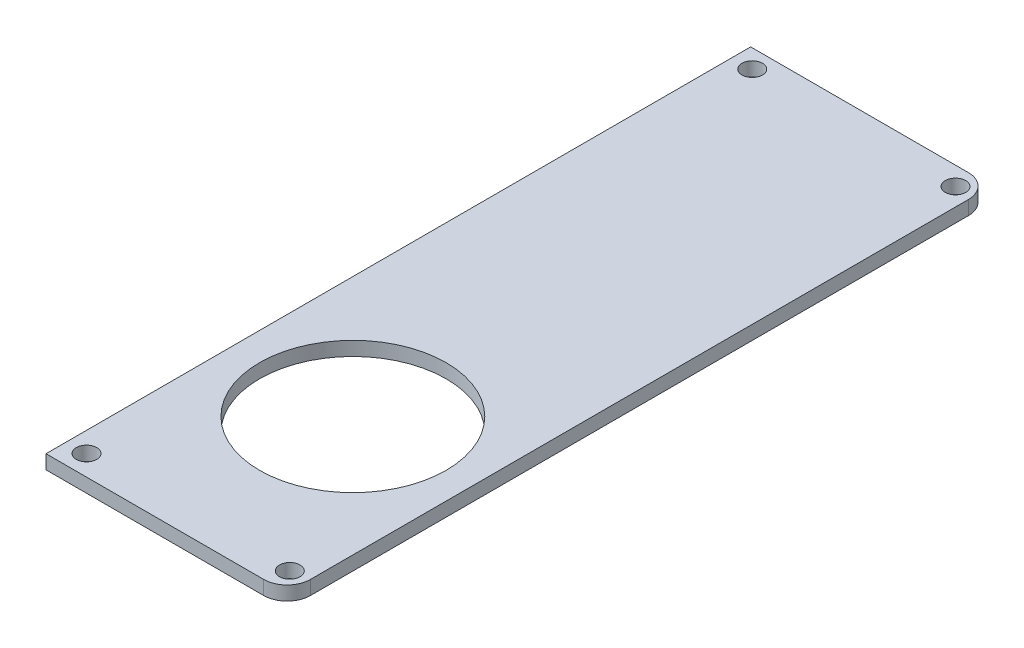
ISO-10303-21;
HEADER;
FILE_DESCRIPTION(('STEP AP214'),'2;1');
FILE_NAME('part.step','',(''),(''),'','','');
FILE_SCHEMA(('AUTOMOTIVE_DESIGN { 1 0 10303 214 1 1 1 1 }'));
ENDSEC;
DATA;
#1=APPLICATION_CONTEXT('core data for automotive mechanical design processes');
#2=APPLICATION_PROTOCOL_DEFINITION('international standard','automotive_design',2000,#1);
#3=PRODUCT_CONTEXT('',#1,'mechanical');
#4=PRODUCT('Part','Part','',(#3));
#5=PRODUCT_RELATED_PRODUCT_CATEGORY('part','',(#4));
#6=PRODUCT_DEFINITION_FORMATION('','',#4);
#7=PRODUCT_DEFINITION_CONTEXT('part definition',#1,'design');
#8=PRODUCT_DEFINITION('design','',#6,#7);
#9=PRODUCT_DEFINITION_SHAPE('','',#8);
#10=(LENGTH_UNIT() NAMED_UNIT(*) SI_UNIT(.MILLI.,.METRE.));
#11=(NAMED_UNIT(*) PLANE_ANGLE_UNIT() SI_UNIT($,.RADIAN.));
#12=(NAMED_UNIT(*) SI_UNIT($,.STERADIAN.) SOLID_ANGLE_UNIT());
#13=UNCERTAINTY_MEASURE_WITH_UNIT(LENGTH_MEASURE(1.E-05),#10,'distance_accuracy_value','');
#14=(GEOMETRIC_REPRESENTATION_CONTEXT(3) GLOBAL_UNCERTAINTY_ASSIGNED_CONTEXT((#13)) GLOBAL_UNIT_ASSIGNED_CONTEXT((#10,
#11,#12)) REPRESENTATION_CONTEXT('',''));
#15=CARTESIAN_POINT('',(0.,0.,0.));
#16=DIRECTION('',(0.,0.,1.));
#17=DIRECTION('',(1.,0.,0.));
#18=AXIS2_PLACEMENT_3D('',#15,#16,#17);
#19=CARTESIAN_POINT('',(10.42,1.5,-35.265));
#20=DIRECTION('',(0.,1.,0.));
#21=DIRECTION('',(0.,0.,1.));
#22=AXIS2_PLACEMENT_3D('',#19,#20,#21);
#23=PLANE('',#22);
#24=CARTESIAN_POINT('',(11.02,1.5,35.575));
#25=DIRECTION('',(0.,1.,0.));
#26=DIRECTION('',(0.,0.,1.));
#27=AXIS2_PLACEMENT_3D('',#24,#25,#26);
#28=CIRCLE('',#27,1.1);
#29=CARTESIAN_POINT('',(11.02,1.5,36.675));
#30=VERTEX_POINT('',#29);
#31=EDGE_CURVE('E193',#30,#30,#28,.T.);
#32=ORIENTED_EDGE('',*,*,#31,.F.);
#33=EDGE_LOOP('',(#32));
#34=FACE_BOUND('',#33,.T.);
#35=CARTESIAN_POINT('',(-10.77,1.5,-35.785));
#36=DIRECTION('',(0.,1.,0.));
#37=DIRECTION('',(0.,0.,1.));
#38=AXIS2_PLACEMENT_3D('',#35,#36,#37);
#39=CIRCLE('',#38,1.1);
#40=CARTESIAN_POINT('',(-10.77,1.5,-34.685));
#41=VERTEX_POINT('',#40);
#42=EDGE_CURVE('E205',#41,#41,#39,.T.);
#43=ORIENTED_EDGE('',*,*,#42,.F.);
#44=EDGE_LOOP('',(#43));
#45=FACE_BOUND('',#44,.T.);
#46=DIRECTION('',(0.,0.,1.));
#47=VECTOR('',#46,1.);
#48=CARTESIAN_POINT('',(-12.92,1.5,37.765));
#49=LINE('',#48,#47);
#50=CARTESIAN_POINT('',(-12.92,1.5,-37.765));
#51=VERTEX_POINT('',#50);
#52=CARTESIAN_POINT('',(-12.92,1.5,37.765));
#53=VERTEX_POINT('',#52);
#54=EDGE_CURVE('E129',#51,#53,#49,.T.);
#55=ORIENTED_EDGE('',*,*,#54,.T.);
#56=DIRECTION('',(1.,0.,0.));
#57=VECTOR('',#56,1.);
#58=CARTESIAN_POINT('',(-12.92,1.5,37.765));
#59=LINE('',#58,#57);
#60=CARTESIAN_POINT('',(10.42,1.5,37.765));
#61=VERTEX_POINT('',#60);
#62=EDGE_CURVE('E87',#53,#61,#59,.T.);
#63=ORIENTED_EDGE('',*,*,#62,.T.);
#64=CARTESIAN_POINT('',(10.42,1.5,35.265));
#65=DIRECTION('',(0.,1.,0.));
#66=DIRECTION('',(0.,0.,1.));
#67=AXIS2_PLACEMENT_3D('',#64,#65,#66);
#68=CIRCLE('',#67,2.5);
#69=CARTESIAN_POINT('',(12.92,1.5,35.265));
#70=VERTEX_POINT('',#69);
#71=EDGE_CURVE('E100',#61,#70,#68,.T.);
#72=ORIENTED_EDGE('',*,*,#71,.T.);
#73=DIRECTION('',(0.,0.,-1.));
#74=VECTOR('',#73,1.);
#75=CARTESIAN_POINT('',(12.92,1.5,35.265));
#76=LINE('',#75,#74);
#77=CARTESIAN_POINT('',(12.92,1.5,-35.265));
#78=VERTEX_POINT('',#77);
#79=EDGE_CURVE('E94',#70,#78,#76,.T.);
#80=ORIENTED_EDGE('',*,*,#79,.T.);
#81=CARTESIAN_POINT('',(10.42,1.5,-35.265));
#82=DIRECTION('',(0.,1.,0.));
#83=DIRECTION('',(0.,0.,1.));
#84=AXIS2_PLACEMENT_3D('',#81,#82,#83);
#85=CIRCLE('',#84,2.5);
#86=CARTESIAN_POINT('',(10.42,1.5,-37.765));
#87=VERTEX_POINT('',#86);
#88=EDGE_CURVE('E98',#78,#87,#85,.T.);
#89=ORIENTED_EDGE('',*,*,#88,.T.);
#90=DIRECTION('',(-1.,0.,0.));
#91=VECTOR('',#90,1.);
#92=CARTESIAN_POINT('',(-12.92,1.5,-37.765));
#93=LINE('',#92,#91);
#94=EDGE_CURVE('E50',#87,#51,#93,.T.);
#95=ORIENTED_EDGE('',*,*,#94,.T.);
#96=EDGE_LOOP('',(#55,#63,#72,#80,#89,#95));
#97=FACE_BOUND('',#96,.T.);
#98=CARTESIAN_POINT('',(11.02,1.5,-35.785));
#99=DIRECTION('',(0.,1.,0.));
#100=DIRECTION('',(0.,0.,1.));
#101=AXIS2_PLACEMENT_3D('',#98,#99,#100);
#102=CIRCLE('',#101,1.1);
#103=CARTESIAN_POINT('',(11.02,1.5,-34.685));
#104=VERTEX_POINT('',#103);
#105=EDGE_CURVE('E122',#104,#104,#102,.T.);
#106=ORIENTED_EDGE('',*,*,#105,.F.);
#107=EDGE_LOOP('',(#106));
#108=FACE_BOUND('',#107,.T.);
#109=CARTESIAN_POINT('',(-10.77,1.5,35.575));
#110=DIRECTION('',(0.,1.,0.));
#111=DIRECTION('',(0.,0.,1.));
#112=AXIS2_PLACEMENT_3D('',#109,#110,#111);
#113=CIRCLE('',#112,1.1);
#114=CARTESIAN_POINT('',(-10.77,1.5,36.675));
#115=VERTEX_POINT('',#114);
#116=EDGE_CURVE('E199',#115,#115,#113,.T.);
#117=ORIENTED_EDGE('',*,*,#116,.F.);
#118=EDGE_LOOP('',(#117));
#119=FACE_BOUND('',#118,.T.);
#120=CARTESIAN_POINT('',(0.0700000000000058,1.5,17.865));
#121=DIRECTION('',(0.,1.,0.));
#122=DIRECTION('',(0.,0.,1.));
#123=AXIS2_PLACEMENT_3D('',#120,#121,#122);
#124=CIRCLE('',#123,10.);
#125=CARTESIAN_POINT('',(0.0700000000000058,1.5,27.865));
#126=VERTEX_POINT('',#125);
#127=EDGE_CURVE('E184',#126,#126,#124,.T.);
#128=ORIENTED_EDGE('',*,*,#127,.F.);
#129=EDGE_LOOP('',(#128));
#130=FACE_BOUND('',#129,.T.);
#131=ADVANCED_FACE('F33',(#34,#45,#97,#108,#119,#130),#23,.T.);
#132=CARTESIAN_POINT('',(10.42,0.,-35.265));
#133=DIRECTION('',(0.,1.,0.));
#134=DIRECTION('',(0.,0.,1.));
#135=AXIS2_PLACEMENT_3D('',#132,#133,#134);
#136=PLANE('',#135);
#137=DIRECTION('',(0.,0.,1.));
#138=VECTOR('',#137,1.);
#139=CARTESIAN_POINT('',(-12.92,0.,37.765));
#140=LINE('',#139,#138);
#141=CARTESIAN_POINT('',(-12.92,0.,-37.765));
#142=VERTEX_POINT('',#141);
#143=CARTESIAN_POINT('',(-12.92,0.,37.765));
#144=VERTEX_POINT('',#143);
#145=EDGE_CURVE('E118',#142,#144,#140,.T.);
#146=ORIENTED_EDGE('',*,*,#145,.F.);
#147=DIRECTION('',(-1.,0.,0.));
#148=VECTOR('',#147,1.);
#149=CARTESIAN_POINT('',(-12.92,0.,-37.765));
#150=LINE('',#149,#148);
#151=CARTESIAN_POINT('',(10.42,0.,-37.765));
#152=VERTEX_POINT('',#151);
#153=EDGE_CURVE('E79',#152,#142,#150,.T.);
#154=ORIENTED_EDGE('',*,*,#153,.F.);
#155=CARTESIAN_POINT('',(10.42,0.,-35.265));
#156=DIRECTION('',(0.,1.,0.));
#157=DIRECTION('',(0.,0.,1.));
#158=AXIS2_PLACEMENT_3D('',#155,#156,#157);
#159=CIRCLE('',#158,2.5);
#160=CARTESIAN_POINT('',(12.92,0.,-35.265));
#161=VERTEX_POINT('',#160);
#162=EDGE_CURVE('E73',#161,#152,#159,.T.);
#163=ORIENTED_EDGE('',*,*,#162,.F.);
#164=DIRECTION('',(0.,0.,-1.));
#165=VECTOR('',#164,1.);
#166=CARTESIAN_POINT('',(12.92,0.,35.265));
#167=LINE('',#166,#165);
#168=CARTESIAN_POINT('',(12.92,0.,35.265));
#169=VERTEX_POINT('',#168);
#170=EDGE_CURVE('E108',#169,#161,#167,.T.);
#171=ORIENTED_EDGE('',*,*,#170,.F.);
#172=CARTESIAN_POINT('',(10.42,0.,35.265));
#173=DIRECTION('',(0.,1.,0.));
#174=DIRECTION('',(0.,0.,1.));
#175=AXIS2_PLACEMENT_3D('',#172,#173,#174);
#176=CIRCLE('',#175,2.5);
#177=CARTESIAN_POINT('',(10.42,0.,37.765));
#178=VERTEX_POINT('',#177);
#179=EDGE_CURVE('E124',#178,#169,#176,.T.);
#180=ORIENTED_EDGE('',*,*,#179,.F.);
#181=DIRECTION('',(1.,0.,0.));
#182=VECTOR('',#181,1.);
#183=CARTESIAN_POINT('',(-12.92,0.,37.765));
#184=LINE('',#183,#182);
#185=EDGE_CURVE('E121',#144,#178,#184,.T.);
#186=ORIENTED_EDGE('',*,*,#185,.F.);
#187=EDGE_LOOP('',(#146,#154,#163,#171,#180,#186));
#188=FACE_BOUND('',#187,.T.);
#189=CARTESIAN_POINT('',(11.02,0.,-35.785));
#190=DIRECTION('',(0.,1.,0.));
#191=DIRECTION('',(0.,0.,1.));
#192=AXIS2_PLACEMENT_3D('',#189,#190,#191);
#193=CIRCLE('',#192,1.1);
#194=CARTESIAN_POINT('',(11.02,0.,-34.685));
#195=VERTEX_POINT('',#194);
#196=EDGE_CURVE('E208',#195,#195,#193,.T.);
#197=ORIENTED_EDGE('',*,*,#196,.T.);
#198=EDGE_LOOP('',(#197));
#199=FACE_BOUND('',#198,.T.);
#200=CARTESIAN_POINT('',(-10.77,0.,-35.785));
#201=DIRECTION('',(0.,1.,0.));
#202=DIRECTION('',(0.,0.,1.));
#203=AXIS2_PLACEMENT_3D('',#200,#201,#202);
#204=CIRCLE('',#203,1.1);
#205=CARTESIAN_POINT('',(-10.77,0.,-34.685));
#206=VERTEX_POINT('',#205);
#207=EDGE_CURVE('E202',#206,#206,#204,.T.);
#208=ORIENTED_EDGE('',*,*,#207,.T.);
#209=EDGE_LOOP('',(#208));
#210=FACE_BOUND('',#209,.T.);
#211=CARTESIAN_POINT('',(-10.77,0.,35.575));
#212=DIRECTION('',(0.,1.,0.));
#213=DIRECTION('',(0.,0.,1.));
#214=AXIS2_PLACEMENT_3D('',#211,#212,#213);
#215=CIRCLE('',#214,1.1);
#216=CARTESIAN_POINT('',(-10.77,0.,36.675));
#217=VERTEX_POINT('',#216);
#218=EDGE_CURVE('E196',#217,#217,#215,.T.);
#219=ORIENTED_EDGE('',*,*,#218,.T.);
#220=EDGE_LOOP('',(#219));
#221=FACE_BOUND('',#220,.T.);
#222=CARTESIAN_POINT('',(11.02,0.,35.575));
#223=DIRECTION('',(0.,1.,0.));
#224=DIRECTION('',(0.,0.,1.));
#225=AXIS2_PLACEMENT_3D('',#222,#223,#224);
#226=CIRCLE('',#225,1.1);
#227=CARTESIAN_POINT('',(11.02,0.,36.675));
#228=VERTEX_POINT('',#227);
#229=EDGE_CURVE('E190',#228,#228,#226,.T.);
#230=ORIENTED_EDGE('',*,*,#229,.T.);
#231=EDGE_LOOP('',(#230));
#232=FACE_BOUND('',#231,.T.);
#233=CARTESIAN_POINT('',(0.0700000000000058,0.,17.865));
#234=DIRECTION('',(0.,1.,0.));
#235=DIRECTION('',(0.,0.,1.));
#236=AXIS2_PLACEMENT_3D('',#233,#234,#235);
#237=CIRCLE('',#236,10.);
#238=CARTESIAN_POINT('',(0.0700000000000058,0.,27.865));
#239=VERTEX_POINT('',#238);
#240=EDGE_CURVE('E187',#239,#239,#237,.T.);
#241=ORIENTED_EDGE('',*,*,#240,.T.);
#242=EDGE_LOOP('',(#241));
#243=FACE_BOUND('',#242,.T.);
#244=ADVANCED_FACE('F138',(#188,#199,#210,#221,#232,#243),#136,.F.);
#245=CARTESIAN_POINT('',(-12.92,1.5,37.765));
#246=DIRECTION('',(1.,0.,0.));
#247=DIRECTION('',(0.,0.,-1.));
#248=AXIS2_PLACEMENT_3D('',#245,#246,#247);
#249=PLANE('',#248);
#250=ORIENTED_EDGE('',*,*,#145,.T.);
#251=DIRECTION('',(0.,-1.,0.));
#252=VECTOR('',#251,1.);
#253=CARTESIAN_POINT('',(-12.92,1.5,37.765));
#254=LINE('',#253,#252);
#255=EDGE_CURVE('E11',#53,#144,#254,.T.);
#256=ORIENTED_EDGE('',*,*,#255,.F.);
#257=ORIENTED_EDGE('',*,*,#54,.F.);
#258=DIRECTION('',(0.,-1.,0.));
#259=VECTOR('',#258,1.);
#260=CARTESIAN_POINT('',(-12.92,1.5,-37.765));
#261=LINE('',#260,#259);
#262=EDGE_CURVE('E114',#51,#142,#261,.T.);
#263=ORIENTED_EDGE('',*,*,#262,.T.);
#264=EDGE_LOOP('',(#250,#256,#257,#263));
#265=FACE_BOUND('',#264,.T.);
#266=ADVANCED_FACE('F35',(#265),#249,.F.);
#267=CARTESIAN_POINT('',(-12.92,1.5,37.765));
#268=DIRECTION('',(0.,0.,-1.));
#269=DIRECTION('',(-1.,0.,0.));
#270=AXIS2_PLACEMENT_3D('',#267,#268,#269);
#271=PLANE('',#270);
#272=ORIENTED_EDGE('',*,*,#185,.T.);
#273=DIRECTION('',(0.,-1.,0.));
#274=VECTOR('',#273,1.);
#275=CARTESIAN_POINT('',(10.42,1.5,37.765));
#276=LINE('',#275,#274);
#277=EDGE_CURVE('E42',#61,#178,#276,.T.);
#278=ORIENTED_EDGE('',*,*,#277,.F.);
#279=ORIENTED_EDGE('',*,*,#62,.F.);
#280=ORIENTED_EDGE('',*,*,#255,.T.);
#281=EDGE_LOOP('',(#272,#278,#279,#280));
#282=FACE_BOUND('',#281,.T.);
#283=ADVANCED_FACE('F275',(#282),#271,.F.);
#284=CARTESIAN_POINT('',(10.42,1.5,35.265));
#285=DIRECTION('',(0.,-1.,0.));
#286=DIRECTION('',(0.,0.,-1.));
#287=AXIS2_PLACEMENT_3D('',#284,#285,#286);
#288=CYLINDRICAL_SURFACE('',#287,2.5);
#289=ORIENTED_EDGE('',*,*,#179,.T.);
#290=DIRECTION('',(0.,-1.,0.));
#291=VECTOR('',#290,1.);
#292=CARTESIAN_POINT('',(12.92,1.5,35.265));
#293=LINE('',#292,#291);
#294=EDGE_CURVE('E109',#70,#169,#293,.T.);
#295=ORIENTED_EDGE('',*,*,#294,.F.);
#296=ORIENTED_EDGE('',*,*,#71,.F.);
#297=ORIENTED_EDGE('',*,*,#277,.T.);
#298=EDGE_LOOP('',(#289,#295,#296,#297));
#299=FACE_BOUND('',#298,.T.);
#300=ADVANCED_FACE('F135',(#299),#288,.T.);
#301=CARTESIAN_POINT('',(12.92,1.5,35.265));
#302=DIRECTION('',(-1.,0.,0.));
#303=DIRECTION('',(0.,0.,1.));
#304=AXIS2_PLACEMENT_3D('',#301,#302,#303);
#305=PLANE('',#304);
#306=ORIENTED_EDGE('',*,*,#170,.T.);
#307=DIRECTION('',(0.,-1.,0.));
#308=VECTOR('',#307,1.);
#309=CARTESIAN_POINT('',(12.92,1.5,-35.265));
#310=LINE('',#309,#308);
#311=EDGE_CURVE('E105',#78,#161,#310,.T.);
#312=ORIENTED_EDGE('',*,*,#311,.F.);
#313=ORIENTED_EDGE('',*,*,#79,.F.);
#314=ORIENTED_EDGE('',*,*,#294,.T.);
#315=EDGE_LOOP('',(#306,#312,#313,#314));
#316=FACE_BOUND('',#315,.T.);
#317=ADVANCED_FACE('F106',(#316),#305,.F.);
#318=CARTESIAN_POINT('',(10.42,1.5,-35.265));
#319=DIRECTION('',(0.,-1.,0.));
#320=DIRECTION('',(0.,0.,-1.));
#321=AXIS2_PLACEMENT_3D('',#318,#319,#320);
#322=CYLINDRICAL_SURFACE('',#321,2.5);
#323=ORIENTED_EDGE('',*,*,#162,.T.);
#324=DIRECTION('',(0.,-1.,0.));
#325=VECTOR('',#324,1.);
#326=CARTESIAN_POINT('',(10.42,1.5,-37.765));
#327=LINE('',#326,#325);
#328=EDGE_CURVE('E110',#87,#152,#327,.T.);
#329=ORIENTED_EDGE('',*,*,#328,.F.);
#330=ORIENTED_EDGE('',*,*,#88,.F.);
#331=ORIENTED_EDGE('',*,*,#311,.T.);
#332=EDGE_LOOP('',(#323,#329,#330,#331));
#333=FACE_BOUND('',#332,.T.);
#334=ADVANCED_FACE('F112',(#333),#322,.T.);
#335=CARTESIAN_POINT('',(-12.92,1.5,-37.765));
#336=DIRECTION('',(0.,0.,1.));
#337=DIRECTION('',(1.,0.,0.));
#338=AXIS2_PLACEMENT_3D('',#335,#336,#337);
#339=PLANE('',#338);
#340=ORIENTED_EDGE('',*,*,#153,.T.);
#341=ORIENTED_EDGE('',*,*,#262,.F.);
#342=ORIENTED_EDGE('',*,*,#94,.F.);
#343=ORIENTED_EDGE('',*,*,#328,.T.);
#344=EDGE_LOOP('',(#340,#341,#342,#343));
#345=FACE_BOUND('',#344,.T.);
#346=ADVANCED_FACE('F143',(#345),#339,.F.);
#347=CARTESIAN_POINT('',(11.02,1.5,-35.785));
#348=DIRECTION('',(0.,-1.,0.));
#349=DIRECTION('',(0.,0.,-1.));
#350=AXIS2_PLACEMENT_3D('',#347,#348,#349);
#351=CYLINDRICAL_SURFACE('',#350,1.1);
#352=ORIENTED_EDGE('',*,*,#105,.T.);
#353=EDGE_LOOP('',(#352));
#354=FACE_BOUND('',#353,.T.);
#355=ORIENTED_EDGE('',*,*,#196,.F.);
#356=EDGE_LOOP('',(#355));
#357=FACE_BOUND('',#356,.T.);
#358=ADVANCED_FACE('F145',(#354,#357),#351,.F.);
#359=CARTESIAN_POINT('',(-10.77,1.5,-35.785));
#360=DIRECTION('',(0.,-1.,0.));
#361=DIRECTION('',(0.,0.,-1.));
#362=AXIS2_PLACEMENT_3D('',#359,#360,#361);
#363=CYLINDRICAL_SURFACE('',#362,1.1);
#364=ORIENTED_EDGE('',*,*,#42,.T.);
#365=EDGE_LOOP('',(#364));
#366=FACE_BOUND('',#365,.T.);
#367=ORIENTED_EDGE('',*,*,#207,.F.);
#368=EDGE_LOOP('',(#367));
#369=FACE_BOUND('',#368,.T.);
#370=ADVANCED_FACE('F151',(#366,#369),#363,.F.);
#371=CARTESIAN_POINT('',(-10.77,1.5,35.575));
#372=DIRECTION('',(0.,-1.,0.));
#373=DIRECTION('',(0.,0.,-1.));
#374=AXIS2_PLACEMENT_3D('',#371,#372,#373);
#375=CYLINDRICAL_SURFACE('',#374,1.1);
#376=ORIENTED_EDGE('',*,*,#116,.T.);
#377=EDGE_LOOP('',(#376));
#378=FACE_BOUND('',#377,.T.);
#379=ORIENTED_EDGE('',*,*,#218,.F.);
#380=EDGE_LOOP('',(#379));
#381=FACE_BOUND('',#380,.T.);
#382=ADVANCED_FACE('F167',(#378,#381),#375,.F.);
#383=CARTESIAN_POINT('',(11.02,1.5,35.575));
#384=DIRECTION('',(0.,-1.,0.));
#385=DIRECTION('',(0.,0.,-1.));
#386=AXIS2_PLACEMENT_3D('',#383,#384,#385);
#387=CYLINDRICAL_SURFACE('',#386,1.1);
#388=ORIENTED_EDGE('',*,*,#31,.T.);
#389=EDGE_LOOP('',(#388));
#390=FACE_BOUND('',#389,.T.);
#391=ORIENTED_EDGE('',*,*,#229,.F.);
#392=EDGE_LOOP('',(#391));
#393=FACE_BOUND('',#392,.T.);
#394=ADVANCED_FACE('F171',(#390,#393),#387,.F.);
#395=CARTESIAN_POINT('',(0.0700000000000058,1.5,17.865));
#396=DIRECTION('',(0.,-1.,0.));
#397=DIRECTION('',(0.,0.,-1.));
#398=AXIS2_PLACEMENT_3D('',#395,#396,#397);
#399=CYLINDRICAL_SURFACE('',#398,10.);
#400=ORIENTED_EDGE('',*,*,#127,.T.);
#401=EDGE_LOOP('',(#400));
#402=FACE_BOUND('',#401,.T.);
#403=ORIENTED_EDGE('',*,*,#240,.F.);
#404=EDGE_LOOP('',(#403));
#405=FACE_BOUND('',#404,.T.);
#406=ADVANCED_FACE('F175',(#402,#405),#399,.F.);
#407=CLOSED_SHELL('',(#131,#244,#266,#283,#300,#317,#334,#346,#358,#370,#382,#394,#406));
#408=MANIFOLD_SOLID_BREP('B2',#407);
#409=ADVANCED_BREP_SHAPE_REPRESENTATION('',(#18,#408),#14);
#410=SHAPE_DEFINITION_REPRESENTATION(#9,#409);
ENDSEC;
END-ISO-10303-21;
